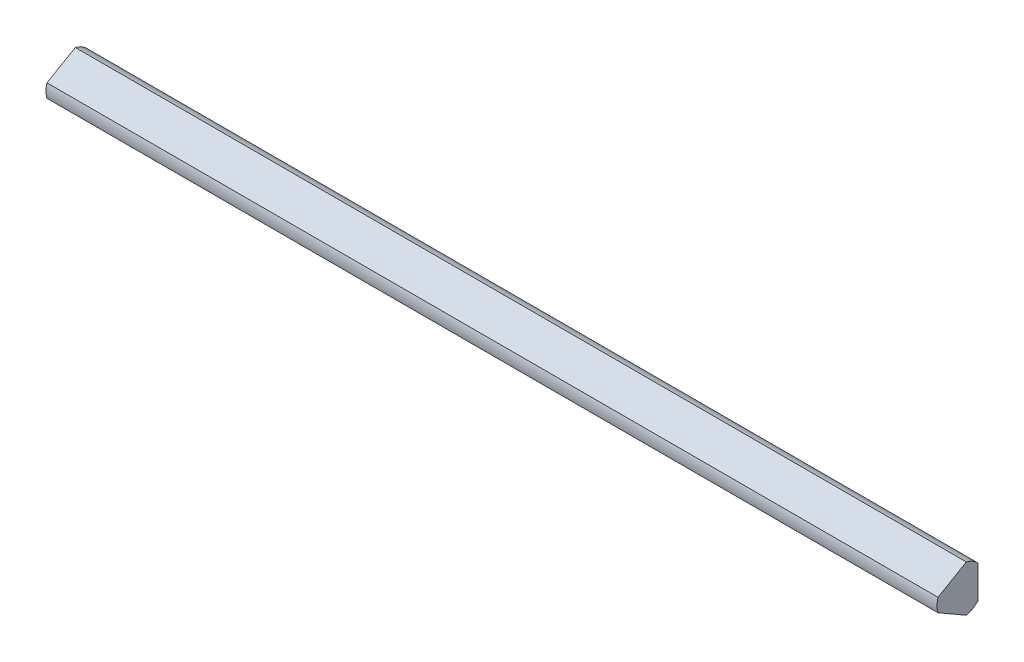
ISO-10303-21;
HEADER;
FILE_DESCRIPTION(('STEP AP214'),'2;1');
FILE_NAME('part.step','',(''),(''),'','','');
FILE_SCHEMA(('AUTOMOTIVE_DESIGN { 1 0 10303 214 1 1 1 1 }'));
ENDSEC;
DATA;
#1=APPLICATION_CONTEXT('core data for automotive mechanical design processes');
#2=APPLICATION_PROTOCOL_DEFINITION('international standard','automotive_design',2000,#1);
#3=PRODUCT_CONTEXT('',#1,'mechanical');
#4=PRODUCT('Part','Part','',(#3));
#5=PRODUCT_RELATED_PRODUCT_CATEGORY('part','',(#4));
#6=PRODUCT_DEFINITION_FORMATION('','',#4);
#7=PRODUCT_DEFINITION_CONTEXT('part definition',#1,'design');
#8=PRODUCT_DEFINITION('design','',#6,#7);
#9=PRODUCT_DEFINITION_SHAPE('','',#8);
#10=(LENGTH_UNIT() NAMED_UNIT(*) SI_UNIT(.MILLI.,.METRE.));
#11=(NAMED_UNIT(*) PLANE_ANGLE_UNIT() SI_UNIT($,.RADIAN.));
#12=(NAMED_UNIT(*) SI_UNIT($,.STERADIAN.) SOLID_ANGLE_UNIT());
#13=UNCERTAINTY_MEASURE_WITH_UNIT(LENGTH_MEASURE(1.E-05),#10,'distance_accuracy_value','');
#14=(GEOMETRIC_REPRESENTATION_CONTEXT(3) GLOBAL_UNCERTAINTY_ASSIGNED_CONTEXT((#13)) GLOBAL_UNIT_ASSIGNED_CONTEXT((#10,
#11,#12)) REPRESENTATION_CONTEXT('',''));
#15=CARTESIAN_POINT('',(0.,0.,0.));
#16=DIRECTION('',(0.,0.,1.));
#17=DIRECTION('',(1.,0.,0.));
#18=AXIS2_PLACEMENT_3D('',#15,#16,#17);
#19=CARTESIAN_POINT('',(75.,-3.59108576208911E-10,2.04020611169198E-10));
#20=DIRECTION('',(-1.,0.,0.));
#21=DIRECTION('',(0.,0.,1.));
#22=AXIS2_PLACEMENT_3D('',#19,#20,#21);
#23=CYLINDRICAL_SURFACE('',#22,2.00000000008218);
#24=CARTESIAN_POINT('',(0.,-3.59108576208911E-10,2.04020611169198E-10));
#25=DIRECTION('',(1.,0.,0.));
#26=DIRECTION('',(0.,0.,-1.));
#27=AXIS2_PLACEMENT_3D('',#24,#25,#26);
#28=CIRCLE('',#27,2.00000000008218);
#29=CARTESIAN_POINT('',(0.,1.37957672317645,-1.44802212124565));
#30=VERTEX_POINT('',#29);
#31=CARTESIAN_POINT('',(0.,1.94381230374748,-0.470737428446541));
#32=VERTEX_POINT('',#31);
#33=EDGE_CURVE('E117',#30,#32,#28,.T.);
#34=ORIENTED_EDGE('',*,*,#33,.T.);
#35=DIRECTION('',(-1.,0.,0.));
#36=VECTOR('',#35,1.);
#37=CARTESIAN_POINT('',(75.,1.94381230374748,-0.470737428446541));
#38=LINE('',#37,#36);
#39=CARTESIAN_POINT('',(75.,1.94381230374748,-0.470737428446541));
#40=VERTEX_POINT('',#39);
#41=EDGE_CURVE('E11',#40,#32,#38,.T.);
#42=ORIENTED_EDGE('',*,*,#41,.F.);
#43=CARTESIAN_POINT('',(75.,-3.59108576208911E-10,2.04020611169198E-10));
#44=DIRECTION('',(1.,0.,0.));
#45=DIRECTION('',(0.,0.,-1.));
#46=AXIS2_PLACEMENT_3D('',#43,#44,#45);
#47=CIRCLE('',#46,2.00000000008218);
#48=CARTESIAN_POINT('',(75.,1.37957672317645,-1.44802212124565));
#49=VERTEX_POINT('',#48);
#50=EDGE_CURVE('E128',#49,#40,#47,.T.);
#51=ORIENTED_EDGE('',*,*,#50,.F.);
#52=DIRECTION('',(-1.,0.,0.));
#53=VECTOR('',#52,1.);
#54=CARTESIAN_POINT('',(75.,1.37957672317645,-1.44802212124565));
#55=LINE('',#54,#53);
#56=EDGE_CURVE('E113',#49,#30,#55,.T.);
#57=ORIENTED_EDGE('',*,*,#56,.T.);
#58=EDGE_LOOP('',(#34,#42,#51,#57));
#59=FACE_BOUND('',#58,.T.);
#60=ADVANCED_FACE('F33',(#59),#23,.T.);
#61=CARTESIAN_POINT('',(75.,1.94381230374748,-0.470737428446541));
#62=DIRECTION('',(0.,-0.866025403784439,-0.5));
#63=DIRECTION('',(0.,0.5,-0.866025403784439));
#64=AXIS2_PLACEMENT_3D('',#61,#62,#63);
#65=PLANE('',#64);
#66=DIRECTION('',(0.,-0.5,0.866025403784439));
#67=VECTOR('',#66,1.);
#68=CARTESIAN_POINT('',(0.,1.94381230374748,-0.470737428446541));
#69=LINE('',#68,#67);
#70=CARTESIAN_POINT('',(0.,0.564235579582959,1.91875955074585));
#71=VERTEX_POINT('',#70);
#72=EDGE_CURVE('E120',#32,#71,#69,.T.);
#73=ORIENTED_EDGE('',*,*,#72,.T.);
#74=DIRECTION('',(-1.,0.,0.));
#75=VECTOR('',#74,1.);
#76=CARTESIAN_POINT('',(75.,0.564235579582959,1.91875955074585));
#77=LINE('',#76,#75);
#78=CARTESIAN_POINT('',(75.,0.564235579582959,1.91875955074585));
#79=VERTEX_POINT('',#78);
#80=EDGE_CURVE('E41',#79,#71,#77,.T.);
#81=ORIENTED_EDGE('',*,*,#80,.F.);
#82=DIRECTION('',(0.,-0.5,0.866025403784439));
#83=VECTOR('',#82,1.);
#84=CARTESIAN_POINT('',(75.,1.94381230374748,-0.470737428446541));
#85=LINE('',#84,#83);
#86=EDGE_CURVE('E86',#40,#79,#85,.T.);
#87=ORIENTED_EDGE('',*,*,#86,.F.);
#88=ORIENTED_EDGE('',*,*,#41,.T.);
#89=EDGE_LOOP('',(#73,#81,#87,#88));
#90=FACE_BOUND('',#89,.T.);
#91=ADVANCED_FACE('F134',(#90),#65,.F.);
#92=CARTESIAN_POINT('',(75.,-5.37149508900159E-11,-1.84511609619818E-08));
#93=DIRECTION('',(-1.,0.,0.));
#94=DIRECTION('',(0.,0.,1.));
#95=AXIS2_PLACEMENT_3D('',#92,#93,#94);
#96=CYLINDRICAL_SURFACE('',#95,2.00000001844372);
#97=CARTESIAN_POINT('',(0.,-5.37149508900159E-11,-1.84511609619818E-08));
#98=DIRECTION('',(1.,0.,0.));
#99=DIRECTION('',(0.,0.,-1.));
#100=AXIS2_PLACEMENT_3D('',#97,#98,#99);
#101=CIRCLE('',#100,2.00000001844372);
#102=CARTESIAN_POINT('',(0.,-0.564235579221918,1.91875955089972));
#103=VERTEX_POINT('',#102);
#104=EDGE_CURVE('E123',#71,#103,#101,.T.);
#105=ORIENTED_EDGE('',*,*,#104,.T.);
#106=DIRECTION('',(-1.,0.,0.));
#107=VECTOR('',#106,1.);
#108=CARTESIAN_POINT('',(75.,-0.564235579221918,1.91875955089972));
#109=LINE('',#108,#107);
#110=CARTESIAN_POINT('',(75.,-0.564235579221918,1.91875955089972));
#111=VERTEX_POINT('',#110);
#112=EDGE_CURVE('E108',#111,#103,#109,.T.);
#113=ORIENTED_EDGE('',*,*,#112,.F.);
#114=CARTESIAN_POINT('',(75.,-5.37149508900158E-11,-1.80705075538821E-08));
#115=DIRECTION('',(1.,0.,0.));
#116=DIRECTION('',(0.,0.,-1.));
#117=AXIS2_PLACEMENT_3D('',#114,#115,#116);
#118=CIRCLE('',#117,2.00000001806306);
#119=EDGE_CURVE('E99',#79,#111,#118,.T.);
#120=ORIENTED_EDGE('',*,*,#119,.F.);
#121=ORIENTED_EDGE('',*,*,#80,.T.);
#122=EDGE_LOOP('',(#105,#113,#120,#121));
#123=FACE_BOUND('',#122,.T.);
#124=ADVANCED_FACE('F133',(#123),#96,.T.);
#125=CARTESIAN_POINT('',(75.,-0.564235579221918,1.91875955089972));
#126=DIRECTION('',(0.,0.866025403784439,-0.5));
#127=DIRECTION('',(0.,0.5,0.866025403784439));
#128=AXIS2_PLACEMENT_3D('',#125,#126,#127);
#129=PLANE('',#128);
#130=DIRECTION('',(0.,-0.5,-0.866025403784439));
#131=VECTOR('',#130,1.);
#132=CARTESIAN_POINT('',(0.,-0.564235579221918,1.91875955089972));
#133=LINE('',#132,#131);
#134=CARTESIAN_POINT('',(0.,-1.94381230380411,-0.470737429016086));
#135=VERTEX_POINT('',#134);
#136=EDGE_CURVE('E107',#103,#135,#133,.T.);
#137=ORIENTED_EDGE('',*,*,#136,.T.);
#138=DIRECTION('',(-1.,0.,0.));
#139=VECTOR('',#138,1.);
#140=CARTESIAN_POINT('',(75.,-1.94381230380411,-0.470737429016086));
#141=LINE('',#140,#139);
#142=CARTESIAN_POINT('',(75.,-1.94381230380411,-0.470737429016086));
#143=VERTEX_POINT('',#142);
#144=EDGE_CURVE('E104',#143,#135,#141,.T.);
#145=ORIENTED_EDGE('',*,*,#144,.F.);
#146=DIRECTION('',(0.,-0.5,-0.866025403784439));
#147=VECTOR('',#146,1.);
#148=CARTESIAN_POINT('',(75.,-0.564235579221918,1.91875955089972));
#149=LINE('',#148,#147);
#150=EDGE_CURVE('E93',#111,#143,#149,.T.);
#151=ORIENTED_EDGE('',*,*,#150,.F.);
#152=ORIENTED_EDGE('',*,*,#112,.T.);
#153=EDGE_LOOP('',(#137,#145,#151,#152));
#154=FACE_BOUND('',#153,.T.);
#155=ADVANCED_FACE('F105',(#154),#129,.F.);
#156=CARTESIAN_POINT('',(75.,-1.12475933962816E-08,-8.09306234701746E-09));
#157=DIRECTION('',(-1.,0.,0.));
#158=DIRECTION('',(0.,0.,1.));
#159=AXIS2_PLACEMENT_3D('',#156,#157,#158);
#160=CYLINDRICAL_SURFACE('',#159,1.99999998703777);
#161=CARTESIAN_POINT('',(0.,-1.12475933962816E-08,-8.09306234701746E-09));
#162=DIRECTION('',(1.,0.,0.));
#163=DIRECTION('',(0.,0.,-1.));
#164=AXIS2_PLACEMENT_3D('',#161,#162,#163);
#165=CIRCLE('',#164,1.99999998703777);
#166=CARTESIAN_POINT('',(0.,-1.37957672458114,-1.44802212124565));
#167=VERTEX_POINT('',#166);
#168=EDGE_CURVE('E72',#135,#167,#165,.T.);
#169=ORIENTED_EDGE('',*,*,#168,.T.);
#170=DIRECTION('',(-1.,0.,0.));
#171=VECTOR('',#170,1.);
#172=CARTESIAN_POINT('',(75.,-1.37957672458114,-1.44802212124565));
#173=LINE('',#172,#171);
#174=CARTESIAN_POINT('',(75.,-1.37957672458114,-1.44802212124565));
#175=VERTEX_POINT('',#174);
#176=EDGE_CURVE('E109',#175,#167,#173,.T.);
#177=ORIENTED_EDGE('',*,*,#176,.F.);
#178=CARTESIAN_POINT('',(75.,-1.12475933962816E-08,-8.09306234701746E-09));
#179=DIRECTION('',(1.,0.,0.));
#180=DIRECTION('',(0.,0.,-1.));
#181=AXIS2_PLACEMENT_3D('',#178,#179,#180);
#182=CIRCLE('',#181,1.99999998703777);
#183=EDGE_CURVE('E97',#143,#175,#182,.T.);
#184=ORIENTED_EDGE('',*,*,#183,.F.);
#185=ORIENTED_EDGE('',*,*,#144,.T.);
#186=EDGE_LOOP('',(#169,#177,#184,#185));
#187=FACE_BOUND('',#186,.T.);
#188=ADVANCED_FACE('F111',(#187),#160,.T.);
#189=CARTESIAN_POINT('',(75.,-1.37957672458114,-1.44802212124565));
#190=DIRECTION('',(0.,0.,1.));
#191=DIRECTION('',(1.,0.,0.));
#192=AXIS2_PLACEMENT_3D('',#189,#190,#191);
#193=PLANE('',#192);
#194=DIRECTION('',(0.,1.,0.));
#195=VECTOR('',#194,1.);
#196=CARTESIAN_POINT('',(0.,-1.37957672458114,-1.44802212124565));
#197=LINE('',#196,#195);
#198=EDGE_CURVE('E78',#167,#30,#197,.T.);
#199=ORIENTED_EDGE('',*,*,#198,.T.);
#200=ORIENTED_EDGE('',*,*,#56,.F.);
#201=DIRECTION('',(0.,1.,0.));
#202=VECTOR('',#201,1.);
#203=CARTESIAN_POINT('',(75.,-1.37957672458114,-1.44802212124565));
#204=LINE('',#203,#202);
#205=EDGE_CURVE('E49',#175,#49,#204,.T.);
#206=ORIENTED_EDGE('',*,*,#205,.F.);
#207=ORIENTED_EDGE('',*,*,#176,.T.);
#208=EDGE_LOOP('',(#199,#200,#206,#207));
#209=FACE_BOUND('',#208,.T.);
#210=ADVANCED_FACE('F141',(#209),#193,.F.);
#211=CARTESIAN_POINT('',(75.,-3.59108576208911E-10,2.04020611169198E-10));
#212=DIRECTION('',(1.,0.,0.));
#213=DIRECTION('',(0.,0.,-1.));
#214=AXIS2_PLACEMENT_3D('',#211,#212,#213);
#215=PLANE('',#214);
#216=ORIENTED_EDGE('',*,*,#50,.T.);
#217=ORIENTED_EDGE('',*,*,#86,.T.);
#218=ORIENTED_EDGE('',*,*,#119,.T.);
#219=ORIENTED_EDGE('',*,*,#150,.T.);
#220=ORIENTED_EDGE('',*,*,#183,.T.);
#221=ORIENTED_EDGE('',*,*,#205,.T.);
#222=EDGE_LOOP('',(#216,#217,#218,#219,#220,#221));
#223=FACE_BOUND('',#222,.T.);
#224=ADVANCED_FACE('F95',(#223),#215,.T.);
#225=CARTESIAN_POINT('',(0.,-3.59108576208911E-10,2.04020611169198E-10));
#226=DIRECTION('',(1.,0.,0.));
#227=DIRECTION('',(0.,0.,-1.));
#228=AXIS2_PLACEMENT_3D('',#225,#226,#227);
#229=PLANE('',#228);
#230=ORIENTED_EDGE('',*,*,#33,.F.);
#231=ORIENTED_EDGE('',*,*,#198,.F.);
#232=ORIENTED_EDGE('',*,*,#168,.F.);
#233=ORIENTED_EDGE('',*,*,#136,.F.);
#234=ORIENTED_EDGE('',*,*,#104,.F.);
#235=ORIENTED_EDGE('',*,*,#72,.F.);
#236=EDGE_LOOP('',(#230,#231,#232,#233,#234,#235));
#237=FACE_BOUND('',#236,.T.);
#238=ADVANCED_FACE('F138',(#237),#229,.F.);
#239=CLOSED_SHELL('',(#60,#91,#124,#155,#188,#210,#224,#238));
#240=MANIFOLD_SOLID_BREP('B2',#239);
#241=ADVANCED_BREP_SHAPE_REPRESENTATION('',(#18,#240),#14);
#242=SHAPE_DEFINITION_REPRESENTATION(#9,#241);
ENDSEC;
END-ISO-10303-21;
